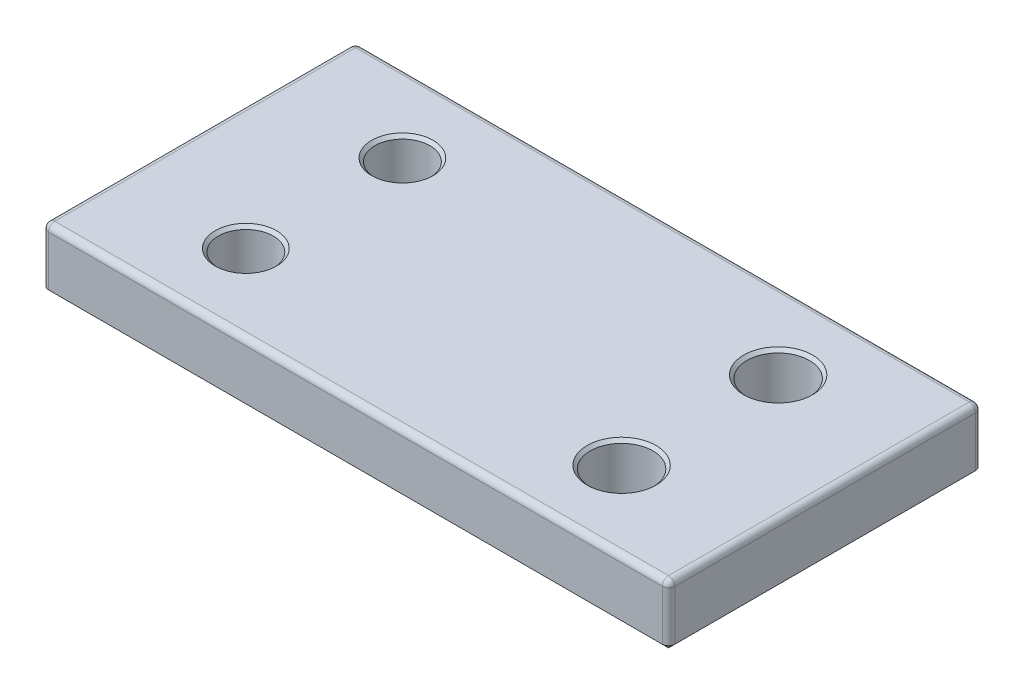
ISO-10303-21;
HEADER;
FILE_DESCRIPTION(('STEP AP214'),'2;1');
FILE_NAME('part.step','',(''),(''),'','','');
FILE_SCHEMA(('AUTOMOTIVE_DESIGN { 1 0 10303 214 1 1 1 1 }'));
ENDSEC;
DATA;
#1=APPLICATION_CONTEXT('core data for automotive mechanical design processes');
#2=APPLICATION_PROTOCOL_DEFINITION('international standard','automotive_design',2000,#1);
#3=PRODUCT_CONTEXT('',#1,'mechanical');
#4=PRODUCT('Part','Part','',(#3));
#5=PRODUCT_RELATED_PRODUCT_CATEGORY('part','',(#4));
#6=PRODUCT_DEFINITION_FORMATION('','',#4);
#7=PRODUCT_DEFINITION_CONTEXT('part definition',#1,'design');
#8=PRODUCT_DEFINITION('design','',#6,#7);
#9=PRODUCT_DEFINITION_SHAPE('','',#8);
#10=(LENGTH_UNIT() NAMED_UNIT(*) SI_UNIT(.MILLI.,.METRE.));
#11=(NAMED_UNIT(*) PLANE_ANGLE_UNIT() SI_UNIT($,.RADIAN.));
#12=(NAMED_UNIT(*) SI_UNIT($,.STERADIAN.) SOLID_ANGLE_UNIT());
#13=UNCERTAINTY_MEASURE_WITH_UNIT(LENGTH_MEASURE(1.E-05),#10,'distance_accuracy_value','');
#14=(GEOMETRIC_REPRESENTATION_CONTEXT(3) GLOBAL_UNCERTAINTY_ASSIGNED_CONTEXT((#13)) GLOBAL_UNIT_ASSIGNED_CONTEXT((#10,
#11,#12)) REPRESENTATION_CONTEXT('',''));
#15=CARTESIAN_POINT('',(0.,0.,0.));
#16=DIRECTION('',(0.,0.,1.));
#17=DIRECTION('',(1.,0.,0.));
#18=AXIS2_PLACEMENT_3D('',#15,#16,#17);
#19=CARTESIAN_POINT('',(-49.,5.,-24.));
#20=DIRECTION('',(0.,-1.,0.));
#21=DIRECTION('',(0.,0.,-1.));
#22=AXIS2_PLACEMENT_3D('',#19,#20,#21);
#23=CYLINDRICAL_SURFACE('',#22,1.);
#24=DIRECTION('',(0.,-1.,0.));
#25=VECTOR('',#24,1.);
#26=CARTESIAN_POINT('',(-49.,5.,-25.));
#27=LINE('',#26,#25);
#28=CARTESIAN_POINT('',(-49.,4.,-25.));
#29=VERTEX_POINT('',#28);
#30=CARTESIAN_POINT('',(-49.,-4.,-25.));
#31=VERTEX_POINT('',#30);
#32=EDGE_CURVE('E206',#29,#31,#27,.T.);
#33=ORIENTED_EDGE('',*,*,#32,.T.);
#34=CARTESIAN_POINT('',(-49.,-4.,-24.));
#35=DIRECTION('',(0.,1.,0.));
#36=DIRECTION('',(0.,0.,1.));
#37=AXIS2_PLACEMENT_3D('',#34,#35,#36);
#38=CIRCLE('',#37,1.);
#39=CARTESIAN_POINT('',(-50.,-4.,-24.));
#40=VERTEX_POINT('',#39);
#41=EDGE_CURVE('E228',#31,#40,#38,.T.);
#42=ORIENTED_EDGE('',*,*,#41,.T.);
#43=DIRECTION('',(0.,-1.,0.));
#44=VECTOR('',#43,1.);
#45=CARTESIAN_POINT('',(-50.,5.,-24.));
#46=LINE('',#45,#44);
#47=CARTESIAN_POINT('',(-50.,4.,-24.));
#48=VERTEX_POINT('',#47);
#49=EDGE_CURVE('E168',#48,#40,#46,.T.);
#50=ORIENTED_EDGE('',*,*,#49,.F.);
#51=CARTESIAN_POINT('',(-49.,4.,-24.));
#52=DIRECTION('',(0.,-1.,0.));
#53=DIRECTION('',(0.,0.,-1.));
#54=AXIS2_PLACEMENT_3D('',#51,#52,#53);
#55=CIRCLE('',#54,1.);
#56=EDGE_CURVE('E155',#48,#29,#55,.T.);
#57=ORIENTED_EDGE('',*,*,#56,.T.);
#58=EDGE_LOOP('',(#33,#42,#50,#57));
#59=FACE_BOUND('',#58,.T.);
#60=ADVANCED_FACE('F45',(#59),#23,.T.);
#61=CARTESIAN_POINT('',(-50.,5.,-24.));
#62=DIRECTION('',(1.,0.,0.));
#63=DIRECTION('',(0.,0.,-1.));
#64=AXIS2_PLACEMENT_3D('',#61,#62,#63);
#65=PLANE('',#64);
#66=ORIENTED_EDGE('',*,*,#49,.T.);
#67=DIRECTION('',(0.,0.,1.));
#68=VECTOR('',#67,1.);
#69=CARTESIAN_POINT('',(-50.,-4.,-24.));
#70=LINE('',#69,#68);
#71=CARTESIAN_POINT('',(-50.,-4.,24.));
#72=VERTEX_POINT('',#71);
#73=EDGE_CURVE('E191',#40,#72,#70,.T.);
#74=ORIENTED_EDGE('',*,*,#73,.T.);
#75=DIRECTION('',(0.,-1.,0.));
#76=VECTOR('',#75,1.);
#77=CARTESIAN_POINT('',(-50.,5.,24.));
#78=LINE('',#77,#76);
#79=CARTESIAN_POINT('',(-50.,4.,24.));
#80=VERTEX_POINT('',#79);
#81=EDGE_CURVE('E440',#80,#72,#78,.T.);
#82=ORIENTED_EDGE('',*,*,#81,.F.);
#83=DIRECTION('',(0.,0.,1.));
#84=VECTOR('',#83,1.);
#85=CARTESIAN_POINT('',(-50.,4.,-24.));
#86=LINE('',#85,#84);
#87=EDGE_CURVE('E189',#80,#48,#86,.F.);
#88=ORIENTED_EDGE('',*,*,#87,.T.);
#89=EDGE_LOOP('',(#66,#74,#82,#88));
#90=FACE_BOUND('',#89,.T.);
#91=ADVANCED_FACE('F291',(#90),#65,.F.);
#92=CARTESIAN_POINT('',(-49.,5.,24.));
#93=DIRECTION('',(0.,-1.,0.));
#94=DIRECTION('',(0.,0.,-1.));
#95=AXIS2_PLACEMENT_3D('',#92,#93,#94);
#96=CYLINDRICAL_SURFACE('',#95,1.);
#97=ORIENTED_EDGE('',*,*,#81,.T.);
#98=CARTESIAN_POINT('',(-49.,-4.,24.));
#99=DIRECTION('',(0.,1.,0.));
#100=DIRECTION('',(0.,0.,1.));
#101=AXIS2_PLACEMENT_3D('',#98,#99,#100);
#102=CIRCLE('',#101,1.);
#103=CARTESIAN_POINT('',(-49.,-4.,25.));
#104=VERTEX_POINT('',#103);
#105=EDGE_CURVE('E218',#72,#104,#102,.T.);
#106=ORIENTED_EDGE('',*,*,#105,.T.);
#107=DIRECTION('',(0.,-1.,0.));
#108=VECTOR('',#107,1.);
#109=CARTESIAN_POINT('',(-49.,5.,25.));
#110=LINE('',#109,#108);
#111=CARTESIAN_POINT('',(-49.,4.,25.));
#112=VERTEX_POINT('',#111);
#113=EDGE_CURVE('E437',#112,#104,#110,.T.);
#114=ORIENTED_EDGE('',*,*,#113,.F.);
#115=CARTESIAN_POINT('',(-49.,4.,24.));
#116=DIRECTION('',(0.,-1.,0.));
#117=DIRECTION('',(0.,0.,-1.));
#118=AXIS2_PLACEMENT_3D('',#115,#116,#117);
#119=CIRCLE('',#118,1.);
#120=EDGE_CURVE('E187',#112,#80,#119,.T.);
#121=ORIENTED_EDGE('',*,*,#120,.T.);
#122=EDGE_LOOP('',(#97,#106,#114,#121));
#123=FACE_BOUND('',#122,.T.);
#124=ADVANCED_FACE('F298',(#123),#96,.T.);
#125=CARTESIAN_POINT('',(49.,5.,25.));
#126=DIRECTION('',(0.,0.,-1.));
#127=DIRECTION('',(-1.,0.,0.));
#128=AXIS2_PLACEMENT_3D('',#125,#126,#127);
#129=PLANE('',#128);
#130=ORIENTED_EDGE('',*,*,#113,.T.);
#131=DIRECTION('',(1.,0.,0.));
#132=VECTOR('',#131,1.);
#133=CARTESIAN_POINT('',(49.,-4.,25.));
#134=LINE('',#133,#132);
#135=CARTESIAN_POINT('',(49.,-4.,25.));
#136=VERTEX_POINT('',#135);
#137=EDGE_CURVE('E220',#104,#136,#134,.T.);
#138=ORIENTED_EDGE('',*,*,#137,.T.);
#139=DIRECTION('',(0.,-1.,0.));
#140=VECTOR('',#139,1.);
#141=CARTESIAN_POINT('',(49.,5.,25.));
#142=LINE('',#141,#140);
#143=CARTESIAN_POINT('',(49.,4.,25.));
#144=VERTEX_POINT('',#143);
#145=EDGE_CURVE('E434',#144,#136,#142,.T.);
#146=ORIENTED_EDGE('',*,*,#145,.F.);
#147=DIRECTION('',(1.,0.,0.));
#148=VECTOR('',#147,1.);
#149=CARTESIAN_POINT('',(-49.,4.,25.));
#150=LINE('',#149,#148);
#151=EDGE_CURVE('E185',#144,#112,#150,.F.);
#152=ORIENTED_EDGE('',*,*,#151,.T.);
#153=EDGE_LOOP('',(#130,#138,#146,#152));
#154=FACE_BOUND('',#153,.T.);
#155=ADVANCED_FACE('F472',(#154),#129,.F.);
#156=CARTESIAN_POINT('',(49.,5.,24.));
#157=DIRECTION('',(0.,-1.,0.));
#158=DIRECTION('',(0.,0.,-1.));
#159=AXIS2_PLACEMENT_3D('',#156,#157,#158);
#160=CYLINDRICAL_SURFACE('',#159,1.);
#161=ORIENTED_EDGE('',*,*,#145,.T.);
#162=CARTESIAN_POINT('',(49.,-4.,24.));
#163=DIRECTION('',(0.,1.,0.));
#164=DIRECTION('',(0.,0.,1.));
#165=AXIS2_PLACEMENT_3D('',#162,#163,#164);
#166=CIRCLE('',#165,1.);
#167=CARTESIAN_POINT('',(50.,-4.,24.));
#168=VERTEX_POINT('',#167);
#169=EDGE_CURVE('E222',#136,#168,#166,.T.);
#170=ORIENTED_EDGE('',*,*,#169,.T.);
#171=DIRECTION('',(0.,-1.,0.));
#172=VECTOR('',#171,1.);
#173=CARTESIAN_POINT('',(50.,5.,24.));
#174=LINE('',#173,#172);
#175=CARTESIAN_POINT('',(50.,4.,24.));
#176=VERTEX_POINT('',#175);
#177=EDGE_CURVE('E431',#176,#168,#174,.T.);
#178=ORIENTED_EDGE('',*,*,#177,.F.);
#179=CARTESIAN_POINT('',(49.,4.,24.));
#180=DIRECTION('',(0.,-1.,0.));
#181=DIRECTION('',(0.,0.,-1.));
#182=AXIS2_PLACEMENT_3D('',#179,#180,#181);
#183=CIRCLE('',#182,1.);
#184=EDGE_CURVE('E183',#176,#144,#183,.T.);
#185=ORIENTED_EDGE('',*,*,#184,.T.);
#186=EDGE_LOOP('',(#161,#170,#178,#185));
#187=FACE_BOUND('',#186,.T.);
#188=ADVANCED_FACE('F465',(#187),#160,.T.);
#189=CARTESIAN_POINT('',(50.,5.,-24.));
#190=DIRECTION('',(-1.,0.,0.));
#191=DIRECTION('',(0.,0.,1.));
#192=AXIS2_PLACEMENT_3D('',#189,#190,#191);
#193=PLANE('',#192);
#194=ORIENTED_EDGE('',*,*,#177,.T.);
#195=DIRECTION('',(0.,0.,-1.));
#196=VECTOR('',#195,1.);
#197=CARTESIAN_POINT('',(50.,-4.,-24.));
#198=LINE('',#197,#196);
#199=CARTESIAN_POINT('',(50.,-4.,-24.));
#200=VERTEX_POINT('',#199);
#201=EDGE_CURVE('E224',#168,#200,#198,.T.);
#202=ORIENTED_EDGE('',*,*,#201,.T.);
#203=DIRECTION('',(0.,-1.,0.));
#204=VECTOR('',#203,1.);
#205=CARTESIAN_POINT('',(50.,5.,-24.));
#206=LINE('',#205,#204);
#207=CARTESIAN_POINT('',(50.,4.,-24.));
#208=VERTEX_POINT('',#207);
#209=EDGE_CURVE('E429',#208,#200,#206,.T.);
#210=ORIENTED_EDGE('',*,*,#209,.F.);
#211=DIRECTION('',(0.,0.,-1.));
#212=VECTOR('',#211,1.);
#213=CARTESIAN_POINT('',(50.,4.,24.));
#214=LINE('',#213,#212);
#215=EDGE_CURVE('E181',#208,#176,#214,.F.);
#216=ORIENTED_EDGE('',*,*,#215,.T.);
#217=EDGE_LOOP('',(#194,#202,#210,#216));
#218=FACE_BOUND('',#217,.T.);
#219=ADVANCED_FACE('F458',(#218),#193,.F.);
#220=CARTESIAN_POINT('',(49.,5.,-24.));
#221=DIRECTION('',(0.,-1.,0.));
#222=DIRECTION('',(0.,0.,-1.));
#223=AXIS2_PLACEMENT_3D('',#220,#221,#222);
#224=CYLINDRICAL_SURFACE('',#223,1.);
#225=ORIENTED_EDGE('',*,*,#209,.T.);
#226=CARTESIAN_POINT('',(49.,-4.,-24.));
#227=DIRECTION('',(0.,1.,0.));
#228=DIRECTION('',(0.,0.,1.));
#229=AXIS2_PLACEMENT_3D('',#226,#227,#228);
#230=CIRCLE('',#229,1.);
#231=CARTESIAN_POINT('',(49.,-4.,-25.));
#232=VERTEX_POINT('',#231);
#233=EDGE_CURVE('E69',#200,#232,#230,.T.);
#234=ORIENTED_EDGE('',*,*,#233,.T.);
#235=DIRECTION('',(0.,-1.,0.));
#236=VECTOR('',#235,1.);
#237=CARTESIAN_POINT('',(49.,5.,-25.));
#238=LINE('',#237,#236);
#239=CARTESIAN_POINT('',(49.,4.,-25.));
#240=VERTEX_POINT('',#239);
#241=EDGE_CURVE('E427',#240,#232,#238,.T.);
#242=ORIENTED_EDGE('',*,*,#241,.F.);
#243=CARTESIAN_POINT('',(49.,4.,-24.));
#244=DIRECTION('',(0.,-1.,0.));
#245=DIRECTION('',(0.,0.,-1.));
#246=AXIS2_PLACEMENT_3D('',#243,#244,#245);
#247=CIRCLE('',#246,1.);
#248=EDGE_CURVE('E175',#240,#208,#247,.T.);
#249=ORIENTED_EDGE('',*,*,#248,.T.);
#250=EDGE_LOOP('',(#225,#234,#242,#249));
#251=FACE_BOUND('',#250,.T.);
#252=ADVANCED_FACE('F455',(#251),#224,.T.);
#253=CARTESIAN_POINT('',(49.,5.,-25.));
#254=DIRECTION('',(0.,0.,1.));
#255=DIRECTION('',(1.,0.,0.));
#256=AXIS2_PLACEMENT_3D('',#253,#254,#255);
#257=PLANE('',#256);
#258=ORIENTED_EDGE('',*,*,#241,.T.);
#259=DIRECTION('',(-1.,0.,0.));
#260=VECTOR('',#259,1.);
#261=CARTESIAN_POINT('',(49.,-4.,-25.));
#262=LINE('',#261,#260);
#263=EDGE_CURVE('E61',#232,#31,#262,.T.);
#264=ORIENTED_EDGE('',*,*,#263,.T.);
#265=ORIENTED_EDGE('',*,*,#32,.F.);
#266=DIRECTION('',(-1.,0.,0.));
#267=VECTOR('',#266,1.);
#268=CARTESIAN_POINT('',(49.,4.,-25.));
#269=LINE('',#268,#267);
#270=EDGE_CURVE('E145',#29,#240,#269,.F.);
#271=ORIENTED_EDGE('',*,*,#270,.T.);
#272=EDGE_LOOP('',(#258,#264,#265,#271));
#273=FACE_BOUND('',#272,.T.);
#274=ADVANCED_FACE('F453',(#273),#257,.F.);
#275=CARTESIAN_POINT('',(-49.,5.,-24.));
#276=DIRECTION('',(0.,1.,0.));
#277=DIRECTION('',(0.,0.,1.));
#278=AXIS2_PLACEMENT_3D('',#275,#276,#277);
#279=PLANE('',#278);
#280=CARTESIAN_POINT('',(30.,5.,12.5));
#281=DIRECTION('',(0.,1.,0.));
#282=DIRECTION('',(0.,0.,1.));
#283=AXIS2_PLACEMENT_3D('',#280,#281,#282);
#284=CIRCLE('',#283,5.49999999999998);
#285=CARTESIAN_POINT('',(30.,5.,18.));
#286=VERTEX_POINT('',#285);
#287=EDGE_CURVE('E264',#286,#286,#284,.F.);
#288=ORIENTED_EDGE('',*,*,#287,.T.);
#289=EDGE_LOOP('',(#288));
#290=FACE_BOUND('',#289,.T.);
#291=CARTESIAN_POINT('',(30.,5.,-12.5));
#292=DIRECTION('',(0.,1.,0.));
#293=DIRECTION('',(0.,0.,1.));
#294=AXIS2_PLACEMENT_3D('',#291,#292,#293);
#295=CIRCLE('',#294,5.49999999999999);
#296=CARTESIAN_POINT('',(30.,5.,-7.00000000000001));
#297=VERTEX_POINT('',#296);
#298=EDGE_CURVE('E261',#297,#297,#295,.F.);
#299=ORIENTED_EDGE('',*,*,#298,.T.);
#300=EDGE_LOOP('',(#299));
#301=FACE_BOUND('',#300,.T.);
#302=CARTESIAN_POINT('',(-30.,5.,12.5));
#303=DIRECTION('',(0.,1.,0.));
#304=DIRECTION('',(0.,0.,1.));
#305=AXIS2_PLACEMENT_3D('',#302,#303,#304);
#306=CIRCLE('',#305,4.89999999999996);
#307=CARTESIAN_POINT('',(-30.,5.,17.4));
#308=VERTEX_POINT('',#307);
#309=EDGE_CURVE('E258',#308,#308,#306,.F.);
#310=ORIENTED_EDGE('',*,*,#309,.T.);
#311=EDGE_LOOP('',(#310));
#312=FACE_BOUND('',#311,.T.);
#313=CARTESIAN_POINT('',(-30.,5.,-12.5));
#314=DIRECTION('',(0.,1.,0.));
#315=DIRECTION('',(0.,0.,1.));
#316=AXIS2_PLACEMENT_3D('',#313,#314,#315);
#317=CIRCLE('',#316,4.89999999999996);
#318=CARTESIAN_POINT('',(-30.,5.,-7.60000000000004));
#319=VERTEX_POINT('',#318);
#320=EDGE_CURVE('E255',#319,#319,#317,.F.);
#321=ORIENTED_EDGE('',*,*,#320,.T.);
#322=EDGE_LOOP('',(#321));
#323=FACE_BOUND('',#322,.T.);
#324=DIRECTION('',(0.,0.,-1.));
#325=VECTOR('',#324,1.);
#326=CARTESIAN_POINT('',(49.,5.,-24.));
#327=LINE('',#326,#325);
#328=CARTESIAN_POINT('',(49.,5.,24.));
#329=VERTEX_POINT('',#328);
#330=CARTESIAN_POINT('',(49.,5.,-24.));
#331=VERTEX_POINT('',#330);
#332=EDGE_CURVE('E172',#329,#331,#327,.T.);
#333=ORIENTED_EDGE('',*,*,#332,.T.);
#334=DIRECTION('',(-1.,0.,0.));
#335=VECTOR('',#334,1.);
#336=CARTESIAN_POINT('',(-49.,5.,-24.));
#337=LINE('',#336,#335);
#338=CARTESIAN_POINT('',(-49.,5.,-24.));
#339=VERTEX_POINT('',#338);
#340=EDGE_CURVE('E143',#331,#339,#337,.T.);
#341=ORIENTED_EDGE('',*,*,#340,.T.);
#342=DIRECTION('',(0.,0.,1.));
#343=VECTOR('',#342,1.);
#344=CARTESIAN_POINT('',(-49.,5.,24.));
#345=LINE('',#344,#343);
#346=CARTESIAN_POINT('',(-49.,5.,24.));
#347=VERTEX_POINT('',#346);
#348=EDGE_CURVE('E161',#339,#347,#345,.T.);
#349=ORIENTED_EDGE('',*,*,#348,.T.);
#350=DIRECTION('',(1.,0.,0.));
#351=VECTOR('',#350,1.);
#352=CARTESIAN_POINT('',(49.,5.,24.));
#353=LINE('',#352,#351);
#354=EDGE_CURVE('E167',#347,#329,#353,.T.);
#355=ORIENTED_EDGE('',*,*,#354,.T.);
#356=EDGE_LOOP('',(#333,#341,#349,#355));
#357=FACE_BOUND('',#356,.T.);
#358=ADVANCED_FACE('F170',(#290,#301,#312,#323,#357),#279,.T.);
#359=CARTESIAN_POINT('',(-49.,-5.,-24.));
#360=DIRECTION('',(0.,1.,0.));
#361=DIRECTION('',(0.,0.,1.));
#362=AXIS2_PLACEMENT_3D('',#359,#360,#361);
#363=PLANE('',#362);
#364=CARTESIAN_POINT('',(30.,-5.,-12.5));
#365=DIRECTION('',(0.,1.,0.));
#366=DIRECTION('',(0.,0.,1.));
#367=AXIS2_PLACEMENT_3D('',#364,#365,#366);
#368=CIRCLE('',#367,5.);
#369=CARTESIAN_POINT('',(30.,-5.,-7.5));
#370=VERTEX_POINT('',#369);
#371=EDGE_CURVE('E417',#370,#370,#368,.T.);
#372=ORIENTED_EDGE('',*,*,#371,.T.);
#373=EDGE_LOOP('',(#372));
#374=FACE_BOUND('',#373,.T.);
#375=CARTESIAN_POINT('',(30.,-5.,12.5));
#376=DIRECTION('',(0.,1.,0.));
#377=DIRECTION('',(0.,0.,1.));
#378=AXIS2_PLACEMENT_3D('',#375,#376,#377);
#379=CIRCLE('',#378,5.);
#380=CARTESIAN_POINT('',(30.,-5.,17.5));
#381=VERTEX_POINT('',#380);
#382=EDGE_CURVE('E414',#381,#381,#379,.T.);
#383=ORIENTED_EDGE('',*,*,#382,.T.);
#384=EDGE_LOOP('',(#383));
#385=FACE_BOUND('',#384,.T.);
#386=CARTESIAN_POINT('',(-30.,-5.,-12.5));
#387=DIRECTION('',(0.,1.,0.));
#388=DIRECTION('',(0.,0.,1.));
#389=AXIS2_PLACEMENT_3D('',#386,#387,#388);
#390=CIRCLE('',#389,4.39999999999999);
#391=CARTESIAN_POINT('',(-30.,-5.,-8.10000000000001));
#392=VERTEX_POINT('',#391);
#393=EDGE_CURVE('E416',#392,#392,#390,.T.);
#394=ORIENTED_EDGE('',*,*,#393,.T.);
#395=EDGE_LOOP('',(#394));
#396=FACE_BOUND('',#395,.T.);
#397=CARTESIAN_POINT('',(-30.,-5.,12.5));
#398=DIRECTION('',(0.,1.,0.));
#399=DIRECTION('',(0.,0.,1.));
#400=AXIS2_PLACEMENT_3D('',#397,#398,#399);
#401=CIRCLE('',#400,4.39999999999999);
#402=CARTESIAN_POINT('',(-30.,-5.,16.9));
#403=VERTEX_POINT('',#402);
#404=EDGE_CURVE('E234',#403,#403,#401,.T.);
#405=ORIENTED_EDGE('',*,*,#404,.T.);
#406=EDGE_LOOP('',(#405));
#407=FACE_BOUND('',#406,.T.);
#408=DIRECTION('',(-1.,0.,0.));
#409=VECTOR('',#408,1.);
#410=CARTESIAN_POINT('',(-49.,-5.,24.));
#411=LINE('',#410,#409);
#412=CARTESIAN_POINT('',(49.,-5.,24.));
#413=VERTEX_POINT('',#412);
#414=CARTESIAN_POINT('',(-49.,-5.,24.));
#415=VERTEX_POINT('',#414);
#416=EDGE_CURVE('E213',#413,#415,#411,.T.);
#417=ORIENTED_EDGE('',*,*,#416,.T.);
#418=DIRECTION('',(0.,0.,-1.));
#419=VECTOR('',#418,1.);
#420=CARTESIAN_POINT('',(-49.,-5.,-24.));
#421=LINE('',#420,#419);
#422=CARTESIAN_POINT('',(-49.,-5.,-24.));
#423=VERTEX_POINT('',#422);
#424=EDGE_CURVE('E215',#415,#423,#421,.T.);
#425=ORIENTED_EDGE('',*,*,#424,.T.);
#426=DIRECTION('',(1.,0.,0.));
#427=VECTOR('',#426,1.);
#428=CARTESIAN_POINT('',(-49.,-5.,-24.));
#429=LINE('',#428,#427);
#430=CARTESIAN_POINT('',(49.,-5.,-24.));
#431=VERTEX_POINT('',#430);
#432=EDGE_CURVE('E209',#423,#431,#429,.T.);
#433=ORIENTED_EDGE('',*,*,#432,.T.);
#434=DIRECTION('',(0.,0.,1.));
#435=VECTOR('',#434,1.);
#436=CARTESIAN_POINT('',(49.,-5.,-24.));
#437=LINE('',#436,#435);
#438=EDGE_CURVE('E211',#431,#413,#437,.T.);
#439=ORIENTED_EDGE('',*,*,#438,.T.);
#440=EDGE_LOOP('',(#417,#425,#433,#439));
#441=FACE_BOUND('',#440,.T.);
#442=ADVANCED_FACE('F328',(#374,#385,#396,#407,#441),#363,.F.);
#443=CARTESIAN_POINT('',(-49.,4.,24.));
#444=DIRECTION('',(-1.,0.,0.));
#445=DIRECTION('',(0.,0.,1.));
#446=AXIS2_PLACEMENT_3D('',#443,#444,#445);
#447=CYLINDRICAL_SURFACE('',#446,1.);
#448=CARTESIAN_POINT('',(-49.,4.,24.));
#449=DIRECTION('',(-1.,0.,0.));
#450=DIRECTION('',(0.,0.,1.));
#451=AXIS2_PLACEMENT_3D('',#448,#449,#450);
#452=CIRCLE('',#451,1.);
#453=EDGE_CURVE('E200',#112,#347,#452,.T.);
#454=ORIENTED_EDGE('',*,*,#453,.F.);
#455=ORIENTED_EDGE('',*,*,#151,.F.);
#456=CARTESIAN_POINT('',(49.,4.,24.));
#457=DIRECTION('',(1.,0.,0.));
#458=DIRECTION('',(0.,0.,-1.));
#459=AXIS2_PLACEMENT_3D('',#456,#457,#458);
#460=CIRCLE('',#459,1.);
#461=EDGE_CURVE('E203',#329,#144,#460,.T.);
#462=ORIENTED_EDGE('',*,*,#461,.F.);
#463=ORIENTED_EDGE('',*,*,#354,.F.);
#464=EDGE_LOOP('',(#454,#455,#462,#463));
#465=FACE_BOUND('',#464,.T.);
#466=ADVANCED_FACE('F324',(#465),#447,.T.);
#467=CARTESIAN_POINT('',(49.,4.,24.));
#468=DIRECTION('',(0.,1.,0.));
#469=DIRECTION('',(0.,0.,1.));
#470=AXIS2_PLACEMENT_3D('',#467,#468,#469);
#471=SPHERICAL_SURFACE('',#470,1.);
#472=ORIENTED_EDGE('',*,*,#461,.T.);
#473=ORIENTED_EDGE('',*,*,#184,.F.);
#474=CARTESIAN_POINT('',(49.,4.,24.));
#475=DIRECTION('',(0.,0.,-1.));
#476=DIRECTION('',(-1.,0.,0.));
#477=AXIS2_PLACEMENT_3D('',#474,#475,#476);
#478=CIRCLE('',#477,1.);
#479=EDGE_CURVE('E197',#329,#176,#478,.T.);
#480=ORIENTED_EDGE('',*,*,#479,.F.);
#481=EDGE_LOOP('',(#472,#473,#480));
#482=FACE_BOUND('',#481,.T.);
#483=ADVANCED_FACE('F320',(#482),#471,.T.);
#484=CARTESIAN_POINT('',(-49.,4.,24.));
#485=DIRECTION('',(0.,1.,0.));
#486=DIRECTION('',(0.,0.,1.));
#487=AXIS2_PLACEMENT_3D('',#484,#485,#486);
#488=SPHERICAL_SURFACE('',#487,1.);
#489=ORIENTED_EDGE('',*,*,#120,.F.);
#490=ORIENTED_EDGE('',*,*,#453,.T.);
#491=CARTESIAN_POINT('',(-49.,4.,24.));
#492=DIRECTION('',(0.,0.,-1.));
#493=DIRECTION('',(-1.,0.,0.));
#494=AXIS2_PLACEMENT_3D('',#491,#492,#493);
#495=CIRCLE('',#494,1.);
#496=EDGE_CURVE('E164',#80,#347,#495,.T.);
#497=ORIENTED_EDGE('',*,*,#496,.F.);
#498=EDGE_LOOP('',(#489,#490,#497));
#499=FACE_BOUND('',#498,.T.);
#500=ADVANCED_FACE('F316',(#499),#488,.T.);
#501=CARTESIAN_POINT('',(49.,4.,-24.));
#502=DIRECTION('',(0.,0.,1.));
#503=DIRECTION('',(1.,0.,0.));
#504=AXIS2_PLACEMENT_3D('',#501,#502,#503);
#505=CYLINDRICAL_SURFACE('',#504,1.);
#506=ORIENTED_EDGE('',*,*,#479,.T.);
#507=ORIENTED_EDGE('',*,*,#215,.F.);
#508=CARTESIAN_POINT('',(49.,4.,-24.));
#509=DIRECTION('',(0.,0.,-1.));
#510=DIRECTION('',(-1.,0.,0.));
#511=AXIS2_PLACEMENT_3D('',#508,#509,#510);
#512=CIRCLE('',#511,1.);
#513=EDGE_CURVE('E158',#331,#208,#512,.T.);
#514=ORIENTED_EDGE('',*,*,#513,.F.);
#515=ORIENTED_EDGE('',*,*,#332,.F.);
#516=EDGE_LOOP('',(#506,#507,#514,#515));
#517=FACE_BOUND('',#516,.T.);
#518=ADVANCED_FACE('F313',(#517),#505,.T.);
#519=CARTESIAN_POINT('',(-49.,4.,-24.));
#520=DIRECTION('',(0.,0.,-1.));
#521=DIRECTION('',(-1.,0.,0.));
#522=AXIS2_PLACEMENT_3D('',#519,#520,#521);
#523=CYLINDRICAL_SURFACE('',#522,1.);
#524=ORIENTED_EDGE('',*,*,#496,.T.);
#525=ORIENTED_EDGE('',*,*,#348,.F.);
#526=CARTESIAN_POINT('',(-49.,4.,-24.));
#527=DIRECTION('',(0.,0.,-1.));
#528=DIRECTION('',(-1.,0.,0.));
#529=AXIS2_PLACEMENT_3D('',#526,#527,#528);
#530=CIRCLE('',#529,1.);
#531=EDGE_CURVE('E152',#48,#339,#530,.T.);
#532=ORIENTED_EDGE('',*,*,#531,.F.);
#533=ORIENTED_EDGE('',*,*,#87,.F.);
#534=EDGE_LOOP('',(#524,#525,#532,#533));
#535=FACE_BOUND('',#534,.T.);
#536=ADVANCED_FACE('F162',(#535),#523,.T.);
#537=CARTESIAN_POINT('',(49.,4.,-24.));
#538=DIRECTION('',(0.,1.,0.));
#539=DIRECTION('',(0.,0.,1.));
#540=AXIS2_PLACEMENT_3D('',#537,#538,#539);
#541=SPHERICAL_SURFACE('',#540,1.);
#542=ORIENTED_EDGE('',*,*,#513,.T.);
#543=ORIENTED_EDGE('',*,*,#248,.F.);
#544=CARTESIAN_POINT('',(49.,4.,-24.));
#545=DIRECTION('',(-1.,0.,0.));
#546=DIRECTION('',(0.,0.,1.));
#547=AXIS2_PLACEMENT_3D('',#544,#545,#546);
#548=CIRCLE('',#547,1.);
#549=EDGE_CURVE('E148',#331,#240,#548,.T.);
#550=ORIENTED_EDGE('',*,*,#549,.F.);
#551=EDGE_LOOP('',(#542,#543,#550));
#552=FACE_BOUND('',#551,.T.);
#553=ADVANCED_FACE('F307',(#552),#541,.T.);
#554=CARTESIAN_POINT('',(-49.,4.,-24.));
#555=DIRECTION('',(0.,1.,0.));
#556=DIRECTION('',(0.,0.,1.));
#557=AXIS2_PLACEMENT_3D('',#554,#555,#556);
#558=SPHERICAL_SURFACE('',#557,1.);
#559=ORIENTED_EDGE('',*,*,#56,.F.);
#560=ORIENTED_EDGE('',*,*,#531,.T.);
#561=CARTESIAN_POINT('',(-49.,4.,-24.));
#562=DIRECTION('',(1.,0.,0.));
#563=DIRECTION('',(0.,0.,-1.));
#564=AXIS2_PLACEMENT_3D('',#561,#562,#563);
#565=CIRCLE('',#564,1.);
#566=EDGE_CURVE('E139',#29,#339,#565,.T.);
#567=ORIENTED_EDGE('',*,*,#566,.F.);
#568=EDGE_LOOP('',(#559,#560,#567));
#569=FACE_BOUND('',#568,.T.);
#570=ADVANCED_FACE('F154',(#569),#558,.T.);
#571=CARTESIAN_POINT('',(-49.,4.,-24.));
#572=DIRECTION('',(1.,0.,0.));
#573=DIRECTION('',(0.,0.,-1.));
#574=AXIS2_PLACEMENT_3D('',#571,#572,#573);
#575=CYLINDRICAL_SURFACE('',#574,1.);
#576=ORIENTED_EDGE('',*,*,#549,.T.);
#577=ORIENTED_EDGE('',*,*,#270,.F.);
#578=ORIENTED_EDGE('',*,*,#566,.T.);
#579=ORIENTED_EDGE('',*,*,#340,.F.);
#580=EDGE_LOOP('',(#576,#577,#578,#579));
#581=FACE_BOUND('',#580,.T.);
#582=ADVANCED_FACE('F141',(#581),#575,.T.);
#583=CARTESIAN_POINT('',(50.,-4.,-24.));
#584=DIRECTION('',(-0.707106781186546,0.707106781186549,0.));
#585=DIRECTION('',(0.,0.,-1.));
#586=AXIS2_PLACEMENT_3D('',#583,#584,#585);
#587=PLANE('',#586);
#588=DIRECTION('',(-0.707106781186549,-0.707106781186546,0.));
#589=VECTOR('',#588,1.);
#590=CARTESIAN_POINT('',(50.,-4.,-24.));
#591=LINE('',#590,#589);
#592=EDGE_CURVE('E149',#200,#431,#591,.T.);
#593=ORIENTED_EDGE('',*,*,#592,.F.);
#594=ORIENTED_EDGE('',*,*,#201,.F.);
#595=DIRECTION('',(0.707106781186549,0.707106781186546,0.));
#596=VECTOR('',#595,1.);
#597=CARTESIAN_POINT('',(49.,-5.,24.));
#598=LINE('',#597,#596);
#599=EDGE_CURVE('E248',#413,#168,#598,.T.);
#600=ORIENTED_EDGE('',*,*,#599,.F.);
#601=ORIENTED_EDGE('',*,*,#438,.F.);
#602=EDGE_LOOP('',(#593,#594,#600,#601));
#603=FACE_BOUND('',#602,.T.);
#604=ADVANCED_FACE('F304',(#603),#587,.F.);
#605=CARTESIAN_POINT('',(49.,-4.,-24.));
#606=DIRECTION('',(0.,1.,0.));
#607=DIRECTION('',(0.,0.,1.));
#608=AXIS2_PLACEMENT_3D('',#605,#606,#607);
#609=CONICAL_SURFACE('',#608,1.,0.78539816339745);
#610=ORIENTED_EDGE('',*,*,#233,.F.);
#611=ORIENTED_EDGE('',*,*,#592,.T.);
#612=DIRECTION('',(0.,-0.707106781186546,0.707106781186549));
#613=VECTOR('',#612,1.);
#614=CARTESIAN_POINT('',(49.,-4.,-25.));
#615=LINE('',#614,#613);
#616=EDGE_CURVE('E245',#232,#431,#615,.T.);
#617=ORIENTED_EDGE('',*,*,#616,.F.);
#618=EDGE_LOOP('',(#610,#611,#617));
#619=FACE_BOUND('',#618,.T.);
#620=ADVANCED_FACE('F373',(#619),#609,.T.);
#621=CARTESIAN_POINT('',(49.,-4.,24.));
#622=DIRECTION('',(0.,1.,0.));
#623=DIRECTION('',(0.,0.,1.));
#624=AXIS2_PLACEMENT_3D('',#621,#622,#623);
#625=CONICAL_SURFACE('',#624,1.,0.78539816339745);
#626=ORIENTED_EDGE('',*,*,#599,.T.);
#627=ORIENTED_EDGE('',*,*,#169,.F.);
#628=DIRECTION('',(0.,0.707106781186546,0.707106781186549));
#629=VECTOR('',#628,1.);
#630=CARTESIAN_POINT('',(49.,-5.,24.));
#631=LINE('',#630,#629);
#632=EDGE_CURVE('E242',#413,#136,#631,.T.);
#633=ORIENTED_EDGE('',*,*,#632,.F.);
#634=EDGE_LOOP('',(#626,#627,#633));
#635=FACE_BOUND('',#634,.T.);
#636=ADVANCED_FACE('F366',(#635),#625,.T.);
#637=CARTESIAN_POINT('',(49.,-4.,-25.));
#638=DIRECTION('',(0.,0.707106781186549,0.707106781186546));
#639=DIRECTION('',(-1.,0.,0.));
#640=AXIS2_PLACEMENT_3D('',#637,#638,#639);
#641=PLANE('',#640);
#642=ORIENTED_EDGE('',*,*,#616,.T.);
#643=ORIENTED_EDGE('',*,*,#432,.F.);
#644=DIRECTION('',(0.,-0.707106781186546,0.707106781186549));
#645=VECTOR('',#644,1.);
#646=CARTESIAN_POINT('',(-49.,-4.,-25.));
#647=LINE('',#646,#645);
#648=EDGE_CURVE('E239',#31,#423,#647,.T.);
#649=ORIENTED_EDGE('',*,*,#648,.F.);
#650=ORIENTED_EDGE('',*,*,#263,.F.);
#651=EDGE_LOOP('',(#642,#643,#649,#650));
#652=FACE_BOUND('',#651,.T.);
#653=ADVANCED_FACE('F359',(#652),#641,.F.);
#654=CARTESIAN_POINT('',(49.,-4.,25.));
#655=DIRECTION('',(0.,0.707106781186549,-0.707106781186546));
#656=DIRECTION('',(1.,0.,0.));
#657=AXIS2_PLACEMENT_3D('',#654,#655,#656);
#658=PLANE('',#657);
#659=ORIENTED_EDGE('',*,*,#632,.T.);
#660=ORIENTED_EDGE('',*,*,#137,.F.);
#661=DIRECTION('',(0.,0.707106781186546,0.707106781186549));
#662=VECTOR('',#661,1.);
#663=CARTESIAN_POINT('',(-49.,-5.,24.));
#664=LINE('',#663,#662);
#665=EDGE_CURVE('E236',#415,#104,#664,.T.);
#666=ORIENTED_EDGE('',*,*,#665,.F.);
#667=ORIENTED_EDGE('',*,*,#416,.F.);
#668=EDGE_LOOP('',(#659,#660,#666,#667));
#669=FACE_BOUND('',#668,.T.);
#670=ADVANCED_FACE('F352',(#669),#658,.F.);
#671=CARTESIAN_POINT('',(-49.,-4.,-24.));
#672=DIRECTION('',(0.,1.,0.));
#673=DIRECTION('',(0.,0.,1.));
#674=AXIS2_PLACEMENT_3D('',#671,#672,#673);
#675=CONICAL_SURFACE('',#674,1.,0.78539816339745);
#676=ORIENTED_EDGE('',*,*,#41,.F.);
#677=ORIENTED_EDGE('',*,*,#648,.T.);
#678=DIRECTION('',(0.707106781186549,-0.707106781186546,0.));
#679=VECTOR('',#678,1.);
#680=CARTESIAN_POINT('',(-50.,-4.,-24.));
#681=LINE('',#680,#679);
#682=EDGE_CURVE('E233',#40,#423,#681,.T.);
#683=ORIENTED_EDGE('',*,*,#682,.F.);
#684=EDGE_LOOP('',(#676,#677,#683));
#685=FACE_BOUND('',#684,.T.);
#686=ADVANCED_FACE('F345',(#685),#675,.T.);
#687=CARTESIAN_POINT('',(-49.,-4.,24.));
#688=DIRECTION('',(0.,1.,0.));
#689=DIRECTION('',(0.,0.,1.));
#690=AXIS2_PLACEMENT_3D('',#687,#688,#689);
#691=CONICAL_SURFACE('',#690,1.,0.78539816339745);
#692=ORIENTED_EDGE('',*,*,#665,.T.);
#693=ORIENTED_EDGE('',*,*,#105,.F.);
#694=DIRECTION('',(-0.707106781186549,0.707106781186546,0.));
#695=VECTOR('',#694,1.);
#696=CARTESIAN_POINT('',(-49.,-5.,24.));
#697=LINE('',#696,#695);
#698=EDGE_CURVE('E231',#415,#72,#697,.T.);
#699=ORIENTED_EDGE('',*,*,#698,.F.);
#700=EDGE_LOOP('',(#692,#693,#699));
#701=FACE_BOUND('',#700,.T.);
#702=ADVANCED_FACE('F338',(#701),#691,.T.);
#703=CARTESIAN_POINT('',(-50.,-4.,-24.));
#704=DIRECTION('',(0.707106781186546,0.707106781186549,0.));
#705=DIRECTION('',(0.,0.,1.));
#706=AXIS2_PLACEMENT_3D('',#703,#704,#705);
#707=PLANE('',#706);
#708=ORIENTED_EDGE('',*,*,#682,.T.);
#709=ORIENTED_EDGE('',*,*,#424,.F.);
#710=ORIENTED_EDGE('',*,*,#698,.T.);
#711=ORIENTED_EDGE('',*,*,#73,.F.);
#712=EDGE_LOOP('',(#708,#709,#710,#711));
#713=FACE_BOUND('',#712,.T.);
#714=ADVANCED_FACE('F331',(#713),#707,.F.);
#715=CARTESIAN_POINT('',(-30.,5.,12.5));
#716=DIRECTION('',(0.,1.,0.));
#717=DIRECTION('',(0.,0.,1.));
#718=AXIS2_PLACEMENT_3D('',#715,#716,#717);
#719=CYLINDRICAL_SURFACE('',#718,4.39999999999999);
#720=CARTESIAN_POINT('',(-30.,4.50000000000003,12.5));
#721=DIRECTION('',(0.,1.,0.));
#722=DIRECTION('',(0.,0.,1.));
#723=AXIS2_PLACEMENT_3D('',#720,#721,#722);
#724=CIRCLE('',#723,4.39999999999999);
#725=CARTESIAN_POINT('',(-30.,4.50000000000003,16.9));
#726=VERTEX_POINT('',#725);
#727=EDGE_CURVE('E54',#726,#726,#724,.T.);
#728=ORIENTED_EDGE('',*,*,#727,.T.);
#729=EDGE_LOOP('',(#728));
#730=FACE_BOUND('',#729,.T.);
#731=ORIENTED_EDGE('',*,*,#404,.F.);
#732=EDGE_LOOP('',(#731));
#733=FACE_BOUND('',#732,.T.);
#734=ADVANCED_FACE('F272',(#730,#733),#719,.F.);
#735=CARTESIAN_POINT('',(-30.,5.,-12.5));
#736=DIRECTION('',(0.,1.,0.));
#737=DIRECTION('',(0.,0.,1.));
#738=AXIS2_PLACEMENT_3D('',#735,#736,#737);
#739=CYLINDRICAL_SURFACE('',#738,4.39999999999999);
#740=CARTESIAN_POINT('',(-30.,4.50000000000003,-12.5));
#741=DIRECTION('',(0.,1.,0.));
#742=DIRECTION('',(0.,0.,1.));
#743=AXIS2_PLACEMENT_3D('',#740,#741,#742);
#744=CIRCLE('',#743,4.39999999999999);
#745=CARTESIAN_POINT('',(-30.,4.50000000000003,-8.10000000000001));
#746=VERTEX_POINT('',#745);
#747=EDGE_CURVE('E11',#746,#746,#744,.T.);
#748=ORIENTED_EDGE('',*,*,#747,.T.);
#749=EDGE_LOOP('',(#748));
#750=FACE_BOUND('',#749,.T.);
#751=ORIENTED_EDGE('',*,*,#393,.F.);
#752=EDGE_LOOP('',(#751));
#753=FACE_BOUND('',#752,.T.);
#754=ADVANCED_FACE('F410',(#750,#753),#739,.F.);
#755=CARTESIAN_POINT('',(30.,5.,12.5));
#756=DIRECTION('',(0.,1.,0.));
#757=DIRECTION('',(0.,0.,1.));
#758=AXIS2_PLACEMENT_3D('',#755,#756,#757);
#759=CYLINDRICAL_SURFACE('',#758,5.);
#760=CARTESIAN_POINT('',(30.,4.50000000000003,12.5));
#761=DIRECTION('',(0.,1.,0.));
#762=DIRECTION('',(0.,0.,1.));
#763=AXIS2_PLACEMENT_3D('',#760,#761,#762);
#764=CIRCLE('',#763,5.);
#765=CARTESIAN_POINT('',(30.,4.50000000000003,17.5));
#766=VERTEX_POINT('',#765);
#767=EDGE_CURVE('E230',#766,#766,#764,.T.);
#768=ORIENTED_EDGE('',*,*,#767,.T.);
#769=EDGE_LOOP('',(#768));
#770=FACE_BOUND('',#769,.T.);
#771=ORIENTED_EDGE('',*,*,#382,.F.);
#772=EDGE_LOOP('',(#771));
#773=FACE_BOUND('',#772,.T.);
#774=ADVANCED_FACE('F401',(#770,#773),#759,.F.);
#775=CARTESIAN_POINT('',(30.,5.,-12.5));
#776=DIRECTION('',(0.,1.,0.));
#777=DIRECTION('',(0.,0.,1.));
#778=AXIS2_PLACEMENT_3D('',#775,#776,#777);
#779=CYLINDRICAL_SURFACE('',#778,5.);
#780=CARTESIAN_POINT('',(30.,4.5,-12.5));
#781=DIRECTION('',(0.,1.,0.));
#782=DIRECTION('',(0.,0.,1.));
#783=AXIS2_PLACEMENT_3D('',#780,#781,#782);
#784=CIRCLE('',#783,5.);
#785=CARTESIAN_POINT('',(30.,4.5,-7.5));
#786=VERTEX_POINT('',#785);
#787=EDGE_CURVE('E267',#786,#786,#784,.T.);
#788=ORIENTED_EDGE('',*,*,#787,.T.);
#789=EDGE_LOOP('',(#788));
#790=FACE_BOUND('',#789,.T.);
#791=ORIENTED_EDGE('',*,*,#371,.F.);
#792=EDGE_LOOP('',(#791));
#793=FACE_BOUND('',#792,.T.);
#794=ADVANCED_FACE('F390',(#790,#793),#779,.F.);
#795=CARTESIAN_POINT('',(30.,4.50000000000003,12.5));
#796=DIRECTION('',(0.,1.,0.));
#797=DIRECTION('',(0.,0.,1.));
#798=AXIS2_PLACEMENT_3D('',#795,#796,#797);
#799=CONICAL_SURFACE('',#798,5.,0.785398163397459);
#800=ORIENTED_EDGE('',*,*,#287,.F.);
#801=EDGE_LOOP('',(#800));
#802=FACE_BOUND('',#801,.T.);
#803=ORIENTED_EDGE('',*,*,#767,.F.);
#804=EDGE_LOOP('',(#803));
#805=FACE_BOUND('',#804,.T.);
#806=ADVANCED_FACE('F285',(#802,#805),#799,.F.);
#807=CARTESIAN_POINT('',(30.,4.5,-12.5));
#808=DIRECTION('',(0.,1.,0.));
#809=DIRECTION('',(0.,0.,1.));
#810=AXIS2_PLACEMENT_3D('',#807,#808,#809);
#811=CONICAL_SURFACE('',#810,5.,0.785398163397445);
#812=ORIENTED_EDGE('',*,*,#298,.F.);
#813=EDGE_LOOP('',(#812));
#814=FACE_BOUND('',#813,.T.);
#815=ORIENTED_EDGE('',*,*,#787,.F.);
#816=EDGE_LOOP('',(#815));
#817=FACE_BOUND('',#816,.T.);
#818=ADVANCED_FACE('F277',(#814,#817),#811,.F.);
#819=CARTESIAN_POINT('',(-30.,4.50000000000003,12.5));
#820=DIRECTION('',(0.,1.,0.));
#821=DIRECTION('',(0.,0.,1.));
#822=AXIS2_PLACEMENT_3D('',#819,#820,#821);
#823=CONICAL_SURFACE('',#822,4.39999999999999,0.785398163397447);
#824=ORIENTED_EDGE('',*,*,#309,.F.);
#825=EDGE_LOOP('',(#824));
#826=FACE_BOUND('',#825,.T.);
#827=ORIENTED_EDGE('',*,*,#727,.F.);
#828=EDGE_LOOP('',(#827));
#829=FACE_BOUND('',#828,.T.);
#830=ADVANCED_FACE('F275',(#826,#829),#823,.F.);
#831=CARTESIAN_POINT('',(-30.,4.50000000000003,-12.5));
#832=DIRECTION('',(0.,1.,0.));
#833=DIRECTION('',(0.,0.,1.));
#834=AXIS2_PLACEMENT_3D('',#831,#832,#833);
#835=CONICAL_SURFACE('',#834,4.39999999999999,0.785398163397447);
#836=ORIENTED_EDGE('',*,*,#320,.F.);
#837=EDGE_LOOP('',(#836));
#838=FACE_BOUND('',#837,.T.);
#839=ORIENTED_EDGE('',*,*,#747,.F.);
#840=EDGE_LOOP('',(#839));
#841=FACE_BOUND('',#840,.T.);
#842=ADVANCED_FACE('F48',(#838,#841),#835,.F.);
#843=CLOSED_SHELL('',(#60,#91,#124,#155,#188,#219,#252,#274,#358,#442,#466,#483,#500,#518,#536,
#553,#570,#582,#604,#620,#636,#653,#670,#686,#702,#714,#734,#754,#774,#794,#806,#818,#830,#842));
#844=MANIFOLD_SOLID_BREP('B2',#843);
#845=ADVANCED_BREP_SHAPE_REPRESENTATION('',(#18,#844),#14);
#846=SHAPE_DEFINITION_REPRESENTATION(#9,#845);
ENDSEC;
END-ISO-10303-21;
